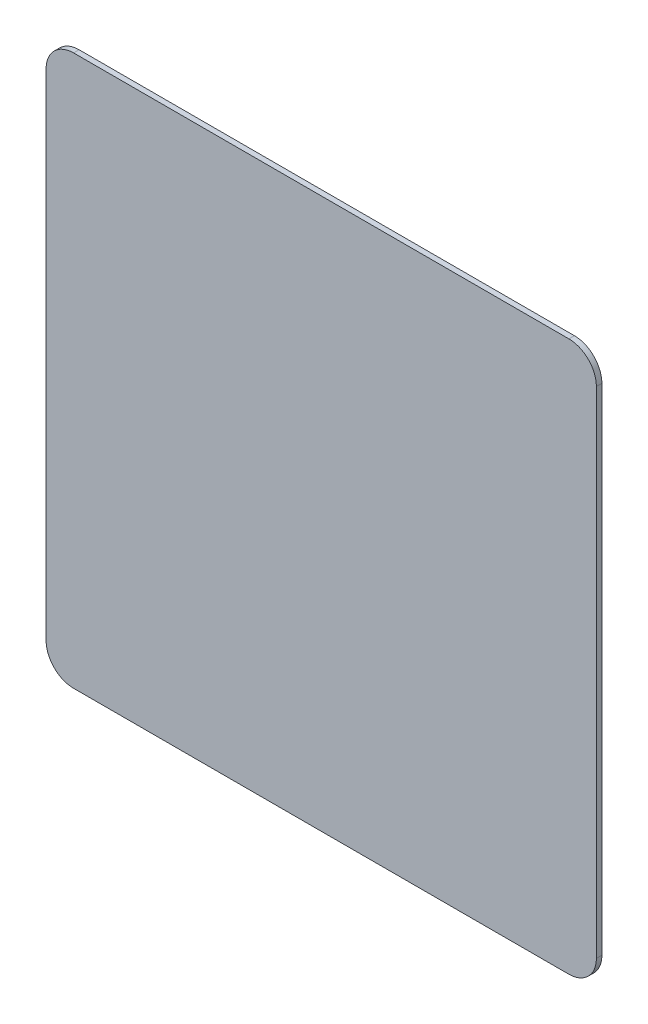
ISO-10303-21;
HEADER;
FILE_DESCRIPTION(('STEP AP214'),'2;1');
FILE_NAME('part.step','',(''),(''),'','','');
FILE_SCHEMA(('AUTOMOTIVE_DESIGN { 1 0 10303 214 1 1 1 1 }'));
ENDSEC;
DATA;
#1=APPLICATION_CONTEXT('core data for automotive mechanical design processes');
#2=APPLICATION_PROTOCOL_DEFINITION('international standard','automotive_design',2000,#1);
#3=PRODUCT_CONTEXT('',#1,'mechanical');
#4=PRODUCT('Part','Part','',(#3));
#5=PRODUCT_RELATED_PRODUCT_CATEGORY('part','',(#4));
#6=PRODUCT_DEFINITION_FORMATION('','',#4);
#7=PRODUCT_DEFINITION_CONTEXT('part definition',#1,'design');
#8=PRODUCT_DEFINITION('design','',#6,#7);
#9=PRODUCT_DEFINITION_SHAPE('','',#8);
#10=(LENGTH_UNIT() NAMED_UNIT(*) SI_UNIT(.MILLI.,.METRE.));
#11=(NAMED_UNIT(*) PLANE_ANGLE_UNIT() SI_UNIT($,.RADIAN.));
#12=(NAMED_UNIT(*) SI_UNIT($,.STERADIAN.) SOLID_ANGLE_UNIT());
#13=UNCERTAINTY_MEASURE_WITH_UNIT(LENGTH_MEASURE(1.E-05),#10,'distance_accuracy_value','');
#14=(GEOMETRIC_REPRESENTATION_CONTEXT(3) GLOBAL_UNCERTAINTY_ASSIGNED_CONTEXT((#13)) GLOBAL_UNIT_ASSIGNED_CONTEXT((#10,
#11,#12)) REPRESENTATION_CONTEXT('',''));
#15=CARTESIAN_POINT('',(0.,0.,0.));
#16=DIRECTION('',(0.,0.,1.));
#17=DIRECTION('',(1.,0.,0.));
#18=AXIS2_PLACEMENT_3D('',#15,#16,#17);
#19=CARTESIAN_POINT('',(-90.,-90.,2.));
#20=DIRECTION('',(0.,0.,-1.));
#21=DIRECTION('',(-1.,0.,0.));
#22=AXIS2_PLACEMENT_3D('',#19,#20,#21);
#23=CYLINDRICAL_SURFACE('',#22,9.99999999999999);
#24=CARTESIAN_POINT('',(-90.,-90.,0.));
#25=DIRECTION('',(0.,0.,1.));
#26=DIRECTION('',(1.,0.,0.));
#27=AXIS2_PLACEMENT_3D('',#24,#25,#26);
#28=CIRCLE('',#27,9.99999999999999);
#29=CARTESIAN_POINT('',(-100.,-89.9999999999999,0.));
#30=VERTEX_POINT('',#29);
#31=CARTESIAN_POINT('',(-89.9999999999999,-100.,0.));
#32=VERTEX_POINT('',#31);
#33=EDGE_CURVE('E140',#30,#32,#28,.T.);
#34=ORIENTED_EDGE('',*,*,#33,.T.);
#35=DIRECTION('',(0.,0.,-1.));
#36=VECTOR('',#35,1.);
#37=CARTESIAN_POINT('',(-89.9999999999999,-100.,2.));
#38=LINE('',#37,#36);
#39=CARTESIAN_POINT('',(-89.9999999999999,-100.,2.));
#40=VERTEX_POINT('',#39);
#41=EDGE_CURVE('E11',#40,#32,#38,.T.);
#42=ORIENTED_EDGE('',*,*,#41,.F.);
#43=CARTESIAN_POINT('',(-90.,-90.,2.));
#44=DIRECTION('',(0.,0.,1.));
#45=DIRECTION('',(1.,0.,0.));
#46=AXIS2_PLACEMENT_3D('',#43,#44,#45);
#47=CIRCLE('',#46,9.99999999999999);
#48=CARTESIAN_POINT('',(-100.,-89.9999999999999,2.));
#49=VERTEX_POINT('',#48);
#50=EDGE_CURVE('E162',#49,#40,#47,.T.);
#51=ORIENTED_EDGE('',*,*,#50,.F.);
#52=DIRECTION('',(0.,0.,-1.));
#53=VECTOR('',#52,1.);
#54=CARTESIAN_POINT('',(-100.,-89.9999999999999,2.));
#55=LINE('',#54,#53);
#56=EDGE_CURVE('E136',#49,#30,#55,.T.);
#57=ORIENTED_EDGE('',*,*,#56,.T.);
#58=EDGE_LOOP('',(#34,#42,#51,#57));
#59=FACE_BOUND('',#58,.T.);
#60=ADVANCED_FACE('F39',(#59),#23,.T.);
#61=CARTESIAN_POINT('',(-89.9999999999999,-100.,2.));
#62=DIRECTION('',(0.,1.,0.));
#63=DIRECTION('',(0.,0.,1.));
#64=AXIS2_PLACEMENT_3D('',#61,#62,#63);
#65=PLANE('',#64);
#66=DIRECTION('',(1.,0.,0.));
#67=VECTOR('',#66,1.);
#68=CARTESIAN_POINT('',(-89.9999999999999,-100.,0.));
#69=LINE('',#68,#67);
#70=CARTESIAN_POINT('',(90.,-100.,0.));
#71=VERTEX_POINT('',#70);
#72=EDGE_CURVE('E144',#32,#71,#69,.T.);
#73=ORIENTED_EDGE('',*,*,#72,.T.);
#74=DIRECTION('',(0.,0.,-1.));
#75=VECTOR('',#74,1.);
#76=CARTESIAN_POINT('',(90.,-100.,2.));
#77=LINE('',#76,#75);
#78=CARTESIAN_POINT('',(90.,-100.,2.));
#79=VERTEX_POINT('',#78);
#80=EDGE_CURVE('E48',#79,#71,#77,.T.);
#81=ORIENTED_EDGE('',*,*,#80,.F.);
#82=DIRECTION('',(1.,0.,0.));
#83=VECTOR('',#82,1.);
#84=CARTESIAN_POINT('',(-89.9999999999999,-100.,2.));
#85=LINE('',#84,#83);
#86=EDGE_CURVE('E99',#40,#79,#85,.T.);
#87=ORIENTED_EDGE('',*,*,#86,.F.);
#88=ORIENTED_EDGE('',*,*,#41,.T.);
#89=EDGE_LOOP('',(#73,#81,#87,#88));
#90=FACE_BOUND('',#89,.T.);
#91=ADVANCED_FACE('F208',(#90),#65,.F.);
#92=CARTESIAN_POINT('',(90.,-90.,2.));
#93=DIRECTION('',(0.,0.,-1.));
#94=DIRECTION('',(-1.,0.,0.));
#95=AXIS2_PLACEMENT_3D('',#92,#93,#94);
#96=CYLINDRICAL_SURFACE('',#95,9.99999999999999);
#97=CARTESIAN_POINT('',(90.,-90.,0.));
#98=DIRECTION('',(0.,0.,1.));
#99=DIRECTION('',(1.,0.,0.));
#100=AXIS2_PLACEMENT_3D('',#97,#98,#99);
#101=CIRCLE('',#100,9.99999999999999);
#102=CARTESIAN_POINT('',(100.,-89.9999999999999,0.));
#103=VERTEX_POINT('',#102);
#104=EDGE_CURVE('E147',#71,#103,#101,.T.);
#105=ORIENTED_EDGE('',*,*,#104,.T.);
#106=DIRECTION('',(0.,0.,-1.));
#107=VECTOR('',#106,1.);
#108=CARTESIAN_POINT('',(100.,-89.9999999999999,2.));
#109=LINE('',#108,#107);
#110=CARTESIAN_POINT('',(100.,-89.9999999999999,2.));
#111=VERTEX_POINT('',#110);
#112=EDGE_CURVE('E173',#111,#103,#109,.T.);
#113=ORIENTED_EDGE('',*,*,#112,.F.);
#114=CARTESIAN_POINT('',(90.,-90.,2.));
#115=DIRECTION('',(0.,0.,1.));
#116=DIRECTION('',(1.,0.,0.));
#117=AXIS2_PLACEMENT_3D('',#114,#115,#116);
#118=CIRCLE('',#117,9.99999999999999);
#119=EDGE_CURVE('E183',#79,#111,#118,.T.);
#120=ORIENTED_EDGE('',*,*,#119,.F.);
#121=ORIENTED_EDGE('',*,*,#80,.T.);
#122=EDGE_LOOP('',(#105,#113,#120,#121));
#123=FACE_BOUND('',#122,.T.);
#124=ADVANCED_FACE('F181',(#123),#96,.T.);
#125=CARTESIAN_POINT('',(100.,-89.9999999999999,2.));
#126=DIRECTION('',(-1.,0.,0.));
#127=DIRECTION('',(0.,0.,1.));
#128=AXIS2_PLACEMENT_3D('',#125,#126,#127);
#129=PLANE('',#128);
#130=DIRECTION('',(0.,1.,0.));
#131=VECTOR('',#130,1.);
#132=CARTESIAN_POINT('',(100.,-89.9999999999999,0.));
#133=LINE('',#132,#131);
#134=CARTESIAN_POINT('',(100.,89.9999999999999,0.));
#135=VERTEX_POINT('',#134);
#136=EDGE_CURVE('E150',#103,#135,#133,.T.);
#137=ORIENTED_EDGE('',*,*,#136,.T.);
#138=DIRECTION('',(0.,0.,-1.));
#139=VECTOR('',#138,1.);
#140=CARTESIAN_POINT('',(100.,89.9999999999999,2.));
#141=LINE('',#140,#139);
#142=CARTESIAN_POINT('',(100.,89.9999999999999,2.));
#143=VERTEX_POINT('',#142);
#144=EDGE_CURVE('E169',#143,#135,#141,.T.);
#145=ORIENTED_EDGE('',*,*,#144,.F.);
#146=DIRECTION('',(0.,1.,0.));
#147=VECTOR('',#146,1.);
#148=CARTESIAN_POINT('',(100.,-89.9999999999999,2.));
#149=LINE('',#148,#147);
#150=EDGE_CURVE('E196',#111,#143,#149,.T.);
#151=ORIENTED_EDGE('',*,*,#150,.F.);
#152=ORIENTED_EDGE('',*,*,#112,.T.);
#153=EDGE_LOOP('',(#137,#145,#151,#152));
#154=FACE_BOUND('',#153,.T.);
#155=ADVANCED_FACE('F191',(#154),#129,.F.);
#156=CARTESIAN_POINT('',(90.,90.,2.));
#157=DIRECTION('',(0.,0.,-1.));
#158=DIRECTION('',(-1.,0.,0.));
#159=AXIS2_PLACEMENT_3D('',#156,#157,#158);
#160=CYLINDRICAL_SURFACE('',#159,9.99999999999999);
#161=CARTESIAN_POINT('',(90.,90.,0.));
#162=DIRECTION('',(0.,0.,1.));
#163=DIRECTION('',(1.,0.,0.));
#164=AXIS2_PLACEMENT_3D('',#161,#162,#163);
#165=CIRCLE('',#164,9.99999999999999);
#166=CARTESIAN_POINT('',(90.,100.,0.));
#167=VERTEX_POINT('',#166);
#168=EDGE_CURVE('E153',#135,#167,#165,.T.);
#169=ORIENTED_EDGE('',*,*,#168,.T.);
#170=DIRECTION('',(0.,0.,-1.));
#171=VECTOR('',#170,1.);
#172=CARTESIAN_POINT('',(90.,100.,2.));
#173=LINE('',#172,#171);
#174=CARTESIAN_POINT('',(90.,100.,2.));
#175=VERTEX_POINT('',#174);
#176=EDGE_CURVE('E129',#175,#167,#173,.T.);
#177=ORIENTED_EDGE('',*,*,#176,.F.);
#178=CARTESIAN_POINT('',(90.,90.,2.));
#179=DIRECTION('',(0.,0.,1.));
#180=DIRECTION('',(1.,0.,0.));
#181=AXIS2_PLACEMENT_3D('',#178,#179,#180);
#182=CIRCLE('',#181,9.99999999999999);
#183=EDGE_CURVE('E118',#143,#175,#182,.T.);
#184=ORIENTED_EDGE('',*,*,#183,.F.);
#185=ORIENTED_EDGE('',*,*,#144,.T.);
#186=EDGE_LOOP('',(#169,#177,#184,#185));
#187=FACE_BOUND('',#186,.T.);
#188=ADVANCED_FACE('F194',(#187),#160,.T.);
#189=CARTESIAN_POINT('',(-89.9999999999999,100.,2.));
#190=DIRECTION('',(0.,-1.,0.));
#191=DIRECTION('',(0.,0.,-1.));
#192=AXIS2_PLACEMENT_3D('',#189,#190,#191);
#193=PLANE('',#192);
#194=DIRECTION('',(-1.,0.,0.));
#195=VECTOR('',#194,1.);
#196=CARTESIAN_POINT('',(-89.9999999999999,100.,0.));
#197=LINE('',#196,#195);
#198=CARTESIAN_POINT('',(-89.9999999999999,100.,0.));
#199=VERTEX_POINT('',#198);
#200=EDGE_CURVE('E127',#167,#199,#197,.T.);
#201=ORIENTED_EDGE('',*,*,#200,.T.);
#202=DIRECTION('',(0.,0.,-1.));
#203=VECTOR('',#202,1.);
#204=CARTESIAN_POINT('',(-89.9999999999999,100.,2.));
#205=LINE('',#204,#203);
#206=CARTESIAN_POINT('',(-89.9999999999999,100.,2.));
#207=VERTEX_POINT('',#206);
#208=EDGE_CURVE('E124',#207,#199,#205,.T.);
#209=ORIENTED_EDGE('',*,*,#208,.F.);
#210=DIRECTION('',(-1.,0.,0.));
#211=VECTOR('',#210,1.);
#212=CARTESIAN_POINT('',(-89.9999999999999,100.,2.));
#213=LINE('',#212,#211);
#214=EDGE_CURVE('E112',#175,#207,#213,.T.);
#215=ORIENTED_EDGE('',*,*,#214,.F.);
#216=ORIENTED_EDGE('',*,*,#176,.T.);
#217=EDGE_LOOP('',(#201,#209,#215,#216));
#218=FACE_BOUND('',#217,.T.);
#219=ADVANCED_FACE('F125',(#218),#193,.F.);
#220=CARTESIAN_POINT('',(-90.,90.,2.));
#221=DIRECTION('',(0.,0.,-1.));
#222=DIRECTION('',(-1.,0.,0.));
#223=AXIS2_PLACEMENT_3D('',#220,#221,#222);
#224=CYLINDRICAL_SURFACE('',#223,9.99999999999999);
#225=CARTESIAN_POINT('',(-90.,90.,0.));
#226=DIRECTION('',(0.,0.,1.));
#227=DIRECTION('',(1.,0.,0.));
#228=AXIS2_PLACEMENT_3D('',#225,#226,#227);
#229=CIRCLE('',#228,9.99999999999999);
#230=CARTESIAN_POINT('',(-100.,89.9999999999999,0.));
#231=VERTEX_POINT('',#230);
#232=EDGE_CURVE('E85',#199,#231,#229,.T.);
#233=ORIENTED_EDGE('',*,*,#232,.T.);
#234=DIRECTION('',(0.,0.,-1.));
#235=VECTOR('',#234,1.);
#236=CARTESIAN_POINT('',(-100.,89.9999999999999,2.));
#237=LINE('',#236,#235);
#238=CARTESIAN_POINT('',(-100.,89.9999999999999,2.));
#239=VERTEX_POINT('',#238);
#240=EDGE_CURVE('E130',#239,#231,#237,.T.);
#241=ORIENTED_EDGE('',*,*,#240,.F.);
#242=CARTESIAN_POINT('',(-90.,90.,2.));
#243=DIRECTION('',(0.,0.,1.));
#244=DIRECTION('',(1.,0.,0.));
#245=AXIS2_PLACEMENT_3D('',#242,#243,#244);
#246=CIRCLE('',#245,9.99999999999999);
#247=EDGE_CURVE('E116',#207,#239,#246,.T.);
#248=ORIENTED_EDGE('',*,*,#247,.F.);
#249=ORIENTED_EDGE('',*,*,#208,.T.);
#250=EDGE_LOOP('',(#233,#241,#248,#249));
#251=FACE_BOUND('',#250,.T.);
#252=ADVANCED_FACE('F132',(#251),#224,.T.);
#253=CARTESIAN_POINT('',(-100.,-89.9999999999999,2.));
#254=DIRECTION('',(1.,0.,0.));
#255=DIRECTION('',(0.,0.,-1.));
#256=AXIS2_PLACEMENT_3D('',#253,#254,#255);
#257=PLANE('',#256);
#258=DIRECTION('',(0.,-1.,0.));
#259=VECTOR('',#258,1.);
#260=CARTESIAN_POINT('',(-100.,-89.9999999999999,0.));
#261=LINE('',#260,#259);
#262=EDGE_CURVE('E91',#231,#30,#261,.T.);
#263=ORIENTED_EDGE('',*,*,#262,.T.);
#264=ORIENTED_EDGE('',*,*,#56,.F.);
#265=DIRECTION('',(0.,-1.,0.));
#266=VECTOR('',#265,1.);
#267=CARTESIAN_POINT('',(-100.,-89.9999999999999,2.));
#268=LINE('',#267,#266);
#269=EDGE_CURVE('E56',#239,#49,#268,.T.);
#270=ORIENTED_EDGE('',*,*,#269,.F.);
#271=ORIENTED_EDGE('',*,*,#240,.T.);
#272=EDGE_LOOP('',(#263,#264,#270,#271));
#273=FACE_BOUND('',#272,.T.);
#274=ADVANCED_FACE('F224',(#273),#257,.F.);
#275=CARTESIAN_POINT('',(-90.,-90.,2.));
#276=DIRECTION('',(0.,0.,1.));
#277=DIRECTION('',(1.,0.,0.));
#278=AXIS2_PLACEMENT_3D('',#275,#276,#277);
#279=PLANE('',#278);
#280=ORIENTED_EDGE('',*,*,#50,.T.);
#281=ORIENTED_EDGE('',*,*,#86,.T.);
#282=ORIENTED_EDGE('',*,*,#119,.T.);
#283=ORIENTED_EDGE('',*,*,#150,.T.);
#284=ORIENTED_EDGE('',*,*,#183,.T.);
#285=ORIENTED_EDGE('',*,*,#214,.T.);
#286=ORIENTED_EDGE('',*,*,#247,.T.);
#287=ORIENTED_EDGE('',*,*,#269,.T.);
#288=EDGE_LOOP('',(#280,#281,#282,#283,#284,#285,#286,#287));
#289=FACE_BOUND('',#288,.T.);
#290=ADVANCED_FACE('F114',(#289),#279,.T.);
#291=CARTESIAN_POINT('',(-90.,-90.,0.));
#292=DIRECTION('',(0.,0.,1.));
#293=DIRECTION('',(1.,0.,0.));
#294=AXIS2_PLACEMENT_3D('',#291,#292,#293);
#295=PLANE('',#294);
#296=ORIENTED_EDGE('',*,*,#33,.F.);
#297=ORIENTED_EDGE('',*,*,#262,.F.);
#298=ORIENTED_EDGE('',*,*,#232,.F.);
#299=ORIENTED_EDGE('',*,*,#200,.F.);
#300=ORIENTED_EDGE('',*,*,#168,.F.);
#301=ORIENTED_EDGE('',*,*,#136,.F.);
#302=ORIENTED_EDGE('',*,*,#104,.F.);
#303=ORIENTED_EDGE('',*,*,#72,.F.);
#304=EDGE_LOOP('',(#296,#297,#298,#299,#300,#301,#302,#303));
#305=FACE_BOUND('',#304,.T.);
#306=ADVANCED_FACE('F187',(#305),#295,.F.);
#307=CLOSED_SHELL('',(#60,#91,#124,#155,#188,#219,#252,#274,#290,#306));
#308=MANIFOLD_SOLID_BREP('B2',#307);
#309=ADVANCED_BREP_SHAPE_REPRESENTATION('',(#18,#308),#14);
#310=SHAPE_DEFINITION_REPRESENTATION(#9,#309);
ENDSEC;
END-ISO-10303-21;
